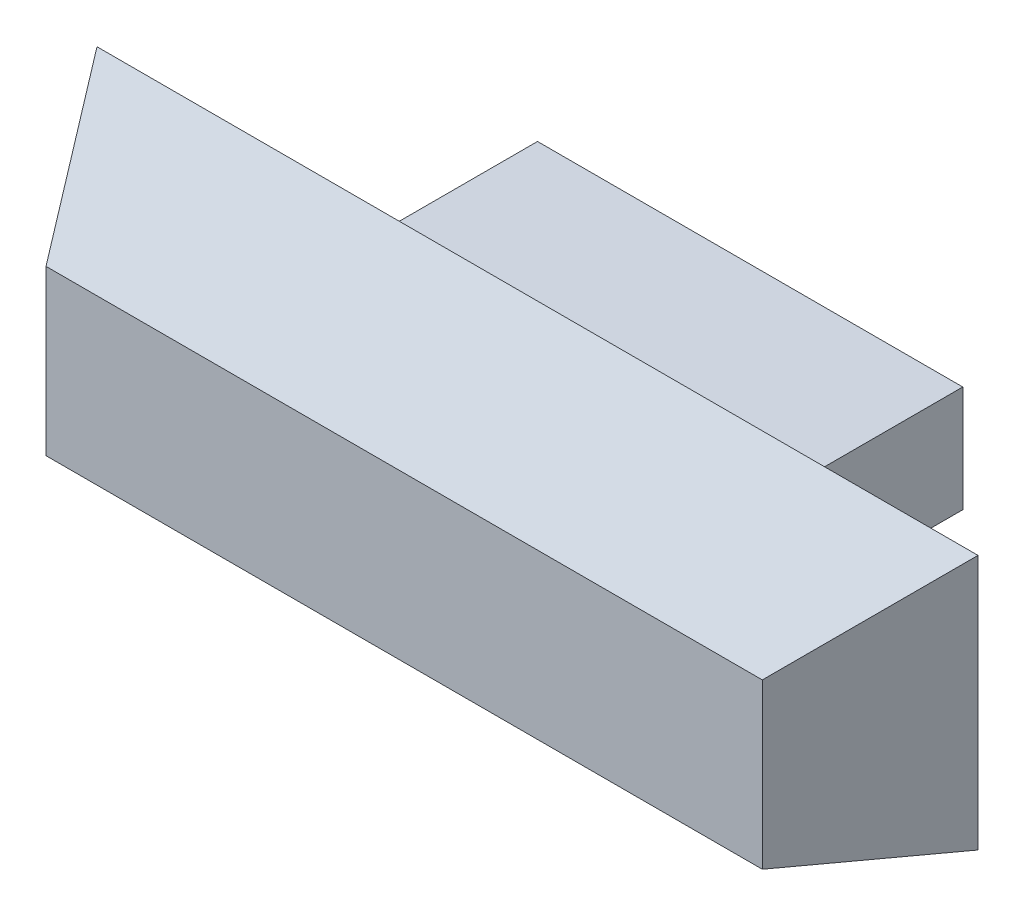
ISO-10303-21;
HEADER;
FILE_DESCRIPTION(('STEP AP214'),'2;1');
FILE_NAME('part.step','',(''),(''),'','','');
FILE_SCHEMA(('AUTOMOTIVE_DESIGN { 1 0 10303 214 1 1 1 1 }'));
ENDSEC;
DATA;
#1=APPLICATION_CONTEXT('core data for automotive mechanical design processes');
#2=APPLICATION_PROTOCOL_DEFINITION('international standard','automotive_design',2000,#1);
#3=PRODUCT_CONTEXT('',#1,'mechanical');
#4=PRODUCT('Part','Part','',(#3));
#5=PRODUCT_RELATED_PRODUCT_CATEGORY('part','',(#4));
#6=PRODUCT_DEFINITION_FORMATION('','',#4);
#7=PRODUCT_DEFINITION_CONTEXT('part definition',#1,'design');
#8=PRODUCT_DEFINITION('design','',#6,#7);
#9=PRODUCT_DEFINITION_SHAPE('','',#8);
#10=(LENGTH_UNIT() NAMED_UNIT(*) SI_UNIT(.MILLI.,.METRE.));
#11=(NAMED_UNIT(*) PLANE_ANGLE_UNIT() SI_UNIT($,.RADIAN.));
#12=(NAMED_UNIT(*) SI_UNIT($,.STERADIAN.) SOLID_ANGLE_UNIT());
#13=UNCERTAINTY_MEASURE_WITH_UNIT(LENGTH_MEASURE(1.E-05),#10,'distance_accuracy_value','');
#14=(GEOMETRIC_REPRESENTATION_CONTEXT(3) GLOBAL_UNCERTAINTY_ASSIGNED_CONTEXT((#13)) GLOBAL_UNIT_ASSIGNED_CONTEXT((#10,
#11,#12)) REPRESENTATION_CONTEXT('',''));
#15=CARTESIAN_POINT('',(0.,0.,0.));
#16=DIRECTION('',(0.,0.,1.));
#17=DIRECTION('',(1.,0.,0.));
#18=AXIS2_PLACEMENT_3D('',#15,#16,#17);
#19=CARTESIAN_POINT('',(0.,0.,2.54));
#20=DIRECTION('',(0.,0.,-1.));
#21=DIRECTION('',(-1.,0.,0.));
#22=AXIS2_PLACEMENT_3D('',#19,#20,#21);
#23=PLANE('',#22);
#24=DIRECTION('',(0.,-1.,0.));
#25=VECTOR('',#24,1.);
#26=CARTESIAN_POINT('',(72.1258566632054,0.,2.54));
#27=LINE('',#26,#25);
#28=CARTESIAN_POINT('',(72.1258566632054,66.7564090512267,2.54));
#29=VERTEX_POINT('',#28);
#30=CARTESIAN_POINT('',(72.1258566632054,64.3075909487768,2.54));
#31=VERTEX_POINT('',#30);
#32=EDGE_CURVE('E140',#29,#31,#27,.T.);
#33=ORIENTED_EDGE('',*,*,#32,.T.);
#34=DIRECTION('',(1.,0.,0.));
#35=VECTOR('',#34,1.);
#36=CARTESIAN_POINT('',(0.,64.3075909487768,2.54));
#37=LINE('',#36,#35);
#38=CARTESIAN_POINT('',(82.8219090512249,64.3075909487768,2.54));
#39=VERTEX_POINT('',#38);
#40=EDGE_CURVE('E147',#31,#39,#37,.T.);
#41=ORIENTED_EDGE('',*,*,#40,.T.);
#42=DIRECTION('',(0.,1.,0.));
#43=VECTOR('',#42,1.);
#44=CARTESIAN_POINT('',(82.8219090512249,0.,2.54));
#45=LINE('',#44,#43);
#46=CARTESIAN_POINT('',(82.8219090512249,66.7564090512267,2.54));
#47=VERTEX_POINT('',#46);
#48=EDGE_CURVE('E145',#39,#47,#45,.T.);
#49=ORIENTED_EDGE('',*,*,#48,.T.);
#50=DIRECTION('',(-1.,0.,0.));
#51=VECTOR('',#50,1.);
#52=CARTESIAN_POINT('',(0.,66.7564090512267,2.54));
#53=LINE('',#52,#51);
#54=EDGE_CURVE('E143',#47,#29,#53,.T.);
#55=ORIENTED_EDGE('',*,*,#54,.T.);
#56=EDGE_LOOP('',(#33,#41,#49,#55));
#57=FACE_BOUND('',#56,.T.);
#58=ADVANCED_FACE('F35',(#57),#23,.F.);
#59=CARTESIAN_POINT('',(0.,0.,0.));
#60=DIRECTION('',(0.,0.,-1.));
#61=DIRECTION('',(-1.,0.,0.));
#62=AXIS2_PLACEMENT_3D('',#59,#60,#61);
#63=PLANE('',#62);
#64=DIRECTION('',(0.,1.,0.));
#65=VECTOR('',#64,1.);
#66=CARTESIAN_POINT('',(73.7499147580763,66.3257500000017,0.));
#67=LINE('',#66,#65);
#68=CARTESIAN_POINT('',(73.7499147580763,64.7382500000017,0.));
#69=VERTEX_POINT('',#68);
#70=CARTESIAN_POINT('',(73.7499147580763,66.3257500000017,0.));
#71=VERTEX_POINT('',#70);
#72=EDGE_CURVE('E53',#69,#71,#67,.T.);
#73=ORIENTED_EDGE('',*,*,#72,.F.);
#74=DIRECTION('',(-1.,0.,0.));
#75=VECTOR('',#74,1.);
#76=CARTESIAN_POINT('',(80.0999147580763,64.7382500000017,0.));
#77=LINE('',#76,#75);
#78=CARTESIAN_POINT('',(80.0999147580763,64.7382500000017,0.));
#79=VERTEX_POINT('',#78);
#80=EDGE_CURVE('E57',#79,#69,#77,.T.);
#81=ORIENTED_EDGE('',*,*,#80,.F.);
#82=DIRECTION('',(0.,-1.,0.));
#83=VECTOR('',#82,1.);
#84=CARTESIAN_POINT('',(80.0999147580763,66.3257500000017,0.));
#85=LINE('',#84,#83);
#86=CARTESIAN_POINT('',(80.0999147580763,66.3257500000017,0.));
#87=VERTEX_POINT('',#86);
#88=EDGE_CURVE('E258',#87,#79,#85,.T.);
#89=ORIENTED_EDGE('',*,*,#88,.F.);
#90=DIRECTION('',(1.,0.,0.));
#91=VECTOR('',#90,1.);
#92=CARTESIAN_POINT('',(80.0999147580763,66.3257500000017,0.));
#93=LINE('',#92,#91);
#94=EDGE_CURVE('E264',#71,#87,#93,.T.);
#95=ORIENTED_EDGE('',*,*,#94,.F.);
#96=EDGE_LOOP('',(#73,#81,#89,#95));
#97=FACE_BOUND('',#96,.T.);
#98=DIRECTION('',(0.,1.,0.));
#99=VECTOR('',#98,1.);
#100=CARTESIAN_POINT('',(83.5025,67.4370000000018,0.));
#101=LINE('',#100,#99);
#102=CARTESIAN_POINT('',(83.5025,63.6270000000018,0.));
#103=VERTEX_POINT('',#102);
#104=CARTESIAN_POINT('',(83.5025,67.4370000000018,0.));
#105=VERTEX_POINT('',#104);
#106=EDGE_CURVE('E128',#103,#105,#101,.T.);
#107=ORIENTED_EDGE('',*,*,#106,.F.);
#108=DIRECTION('',(1.,0.,0.));
#109=VECTOR('',#108,1.);
#110=CARTESIAN_POINT('',(83.5025,63.6270000000018,0.));
#111=LINE('',#110,#109);
#112=CARTESIAN_POINT('',(70.3473295161528,63.6270000000018,0.));
#113=VERTEX_POINT('',#112);
#114=EDGE_CURVE('E137',#113,#103,#111,.T.);
#115=ORIENTED_EDGE('',*,*,#114,.F.);
#116=DIRECTION('',(0.,-1.,0.));
#117=VECTOR('',#116,1.);
#118=CARTESIAN_POINT('',(70.3473295161528,67.4370000000018,0.));
#119=LINE('',#118,#117);
#120=CARTESIAN_POINT('',(70.3473295161528,67.4370000000018,0.));
#121=VERTEX_POINT('',#120);
#122=EDGE_CURVE('E134',#121,#113,#119,.T.);
#123=ORIENTED_EDGE('',*,*,#122,.F.);
#124=DIRECTION('',(-1.,0.,0.));
#125=VECTOR('',#124,1.);
#126=CARTESIAN_POINT('',(83.5025,67.4370000000018,0.));
#127=LINE('',#126,#125);
#128=EDGE_CURVE('E131',#105,#121,#127,.T.);
#129=ORIENTED_EDGE('',*,*,#128,.F.);
#130=EDGE_LOOP('',(#107,#115,#123,#129));
#131=FACE_BOUND('',#130,.T.);
#132=ADVANCED_FACE('F159',(#97,#131),#63,.T.);
#133=CARTESIAN_POINT('',(72.1258566632054,0.,2.54));
#134=DIRECTION('',(0.819152044288994,0.,-0.573576436351043));
#135=DIRECTION('',(0.,-1.,0.));
#136=AXIS2_PLACEMENT_3D('',#133,#134,#135);
#137=PLANE('',#136);
#138=ORIENTED_EDGE('',*,*,#122,.T.);
#139=DIRECTION('',(0.560240011104919,0.214387664158802,0.800105655156676));
#140=VECTOR('',#139,1.);
#141=CARTESIAN_POINT('',(64.4019653308287,61.3518809171087,-8.4908600106266));
#142=LINE('',#141,#140);
#143=EDGE_CURVE('E11',#113,#31,#142,.T.);
#144=ORIENTED_EDGE('',*,*,#143,.T.);
#145=ORIENTED_EDGE('',*,*,#32,.F.);
#146=DIRECTION('',(-0.560240011104919,0.214387664158802,-0.800105655156676));
#147=VECTOR('',#146,1.);
#148=CARTESIAN_POINT('',(80.1438719805896,63.6881462691857,13.99091259355));
#149=LINE('',#148,#147);
#150=EDGE_CURVE('E45',#29,#121,#149,.T.);
#151=ORIENTED_EDGE('',*,*,#150,.T.);
#152=EDGE_LOOP('',(#138,#144,#145,#151));
#153=FACE_BOUND('',#152,.T.);
#154=ADVANCED_FACE('F154',(#153),#137,.F.);
#155=CARTESIAN_POINT('',(0.,66.7564090512267,2.54));
#156=DIRECTION('',(0.,-0.96592582628907,-0.258819045102516));
#157=DIRECTION('',(-1.,0.,0.));
#158=AXIS2_PLACEMENT_3D('',#155,#156,#157);
#159=PLANE('',#158);
#160=ORIENTED_EDGE('',*,*,#150,.F.);
#161=ORIENTED_EDGE('',*,*,#54,.F.);
#162=DIRECTION('',(0.250562807085728,0.250562807085728,-0.935113126531032));
#163=VECTOR('',#162,1.);
#164=CARTESIAN_POINT('',(77.6222071228995,61.5567071229013,21.9455517807246));
#165=LINE('',#164,#163);
#166=EDGE_CURVE('E40',#105,#47,#165,.F.);
#167=ORIENTED_EDGE('',*,*,#166,.F.);
#168=ORIENTED_EDGE('',*,*,#128,.T.);
#169=EDGE_LOOP('',(#160,#161,#167,#168));
#170=FACE_BOUND('',#169,.T.);
#171=ADVANCED_FACE('F38',(#170),#159,.F.);
#172=CARTESIAN_POINT('',(82.8219090512249,0.,2.54));
#173=DIRECTION('',(-0.96592582628907,0.,-0.258819045102516));
#174=DIRECTION('',(0.,1.,0.));
#175=AXIS2_PLACEMENT_3D('',#172,#173,#174);
#176=PLANE('',#175);
#177=ORIENTED_EDGE('',*,*,#166,.T.);
#178=ORIENTED_EDGE('',*,*,#48,.F.);
#179=DIRECTION('',(0.250562807085728,-0.250562807085728,-0.935113126531032));
#180=VECTOR('',#179,1.);
#181=CARTESIAN_POINT('',(86.8592502389957,60.270249761006,-12.5275624402513));
#182=LINE('',#181,#180);
#183=EDGE_CURVE('E122',#103,#39,#182,.F.);
#184=ORIENTED_EDGE('',*,*,#183,.F.);
#185=ORIENTED_EDGE('',*,*,#106,.T.);
#186=EDGE_LOOP('',(#177,#178,#184,#185));
#187=FACE_BOUND('',#186,.T.);
#188=ADVANCED_FACE('F165',(#187),#176,.F.);
#189=CARTESIAN_POINT('',(0.,64.3075909487768,2.54));
#190=DIRECTION('',(0.,0.96592582628907,-0.258819045102516));
#191=DIRECTION('',(1.,0.,0.));
#192=AXIS2_PLACEMENT_3D('',#189,#190,#191);
#193=PLANE('',#192);
#194=ORIENTED_EDGE('',*,*,#143,.F.);
#195=ORIENTED_EDGE('',*,*,#114,.T.);
#196=ORIENTED_EDGE('',*,*,#183,.T.);
#197=ORIENTED_EDGE('',*,*,#40,.F.);
#198=EDGE_LOOP('',(#194,#195,#196,#197));
#199=FACE_BOUND('',#198,.T.);
#200=ADVANCED_FACE('F167',(#199),#193,.F.);
#201=CARTESIAN_POINT('',(73.7499147580763,66.3257500000017,-3.175));
#202=DIRECTION('',(1.,0.,0.));
#203=DIRECTION('',(0.,0.,-1.));
#204=AXIS2_PLACEMENT_3D('',#201,#202,#203);
#205=PLANE('',#204);
#206=ORIENTED_EDGE('',*,*,#72,.T.);
#207=DIRECTION('',(0.,0.,1.));
#208=VECTOR('',#207,1.);
#209=CARTESIAN_POINT('',(73.7499147580763,66.3257500000017,-3.175));
#210=LINE('',#209,#208);
#211=CARTESIAN_POINT('',(73.7499147580763,66.3257500000017,-3.175));
#212=VERTEX_POINT('',#211);
#213=EDGE_CURVE('E105',#212,#71,#210,.T.);
#214=ORIENTED_EDGE('',*,*,#213,.F.);
#215=DIRECTION('',(0.,1.,0.));
#216=VECTOR('',#215,1.);
#217=CARTESIAN_POINT('',(73.7499147580763,66.3257500000017,-3.175));
#218=LINE('',#217,#216);
#219=CARTESIAN_POINT('',(73.7499147580763,64.7382500000017,-3.175));
#220=VERTEX_POINT('',#219);
#221=EDGE_CURVE('E111',#220,#212,#218,.T.);
#222=ORIENTED_EDGE('',*,*,#221,.F.);
#223=DIRECTION('',(0.,0.,1.));
#224=VECTOR('',#223,1.);
#225=CARTESIAN_POINT('',(73.7499147580763,64.7382500000017,-3.175));
#226=LINE('',#225,#224);
#227=EDGE_CURVE('E256',#220,#69,#226,.T.);
#228=ORIENTED_EDGE('',*,*,#227,.T.);
#229=EDGE_LOOP('',(#206,#214,#222,#228));
#230=FACE_BOUND('',#229,.T.);
#231=ADVANCED_FACE('F121',(#230),#205,.F.);
#232=CARTESIAN_POINT('',(80.0999147580763,66.3257500000017,-3.175));
#233=DIRECTION('',(0.,-1.,0.));
#234=DIRECTION('',(0.,0.,-1.));
#235=AXIS2_PLACEMENT_3D('',#232,#233,#234);
#236=PLANE('',#235);
#237=ORIENTED_EDGE('',*,*,#94,.T.);
#238=DIRECTION('',(0.,0.,1.));
#239=VECTOR('',#238,1.);
#240=CARTESIAN_POINT('',(80.0999147580763,66.3257500000017,-3.175));
#241=LINE('',#240,#239);
#242=CARTESIAN_POINT('',(80.0999147580763,66.3257500000017,-3.175));
#243=VERTEX_POINT('',#242);
#244=EDGE_CURVE('E107',#243,#87,#241,.T.);
#245=ORIENTED_EDGE('',*,*,#244,.F.);
#246=DIRECTION('',(1.,0.,0.));
#247=VECTOR('',#246,1.);
#248=CARTESIAN_POINT('',(80.0999147580763,66.3257500000017,-3.175));
#249=LINE('',#248,#247);
#250=EDGE_CURVE('E100',#212,#243,#249,.T.);
#251=ORIENTED_EDGE('',*,*,#250,.F.);
#252=ORIENTED_EDGE('',*,*,#213,.T.);
#253=EDGE_LOOP('',(#237,#245,#251,#252));
#254=FACE_BOUND('',#253,.T.);
#255=ADVANCED_FACE('F103',(#254),#236,.F.);
#256=CARTESIAN_POINT('',(80.0999147580763,66.3257500000017,-3.175));
#257=DIRECTION('',(-1.,0.,0.));
#258=DIRECTION('',(0.,0.,1.));
#259=AXIS2_PLACEMENT_3D('',#256,#257,#258);
#260=PLANE('',#259);
#261=ORIENTED_EDGE('',*,*,#88,.T.);
#262=DIRECTION('',(0.,0.,1.));
#263=VECTOR('',#262,1.);
#264=CARTESIAN_POINT('',(80.0999147580763,64.7382500000017,-3.175));
#265=LINE('',#264,#263);
#266=CARTESIAN_POINT('',(80.0999147580763,64.7382500000017,-3.175));
#267=VERTEX_POINT('',#266);
#268=EDGE_CURVE('E124',#267,#79,#265,.T.);
#269=ORIENTED_EDGE('',*,*,#268,.F.);
#270=DIRECTION('',(0.,-1.,0.));
#271=VECTOR('',#270,1.);
#272=CARTESIAN_POINT('',(80.0999147580763,66.3257500000017,-3.175));
#273=LINE('',#272,#271);
#274=EDGE_CURVE('E110',#243,#267,#273,.T.);
#275=ORIENTED_EDGE('',*,*,#274,.F.);
#276=ORIENTED_EDGE('',*,*,#244,.T.);
#277=EDGE_LOOP('',(#261,#269,#275,#276));
#278=FACE_BOUND('',#277,.T.);
#279=ADVANCED_FACE('F225',(#278),#260,.F.);
#280=CARTESIAN_POINT('',(80.0999147580763,64.7382500000017,-3.175));
#281=DIRECTION('',(0.,1.,0.));
#282=DIRECTION('',(0.,0.,1.));
#283=AXIS2_PLACEMENT_3D('',#280,#281,#282);
#284=PLANE('',#283);
#285=ORIENTED_EDGE('',*,*,#80,.T.);
#286=ORIENTED_EDGE('',*,*,#227,.F.);
#287=DIRECTION('',(-1.,0.,0.));
#288=VECTOR('',#287,1.);
#289=CARTESIAN_POINT('',(80.0999147580763,64.7382500000017,-3.175));
#290=LINE('',#289,#288);
#291=EDGE_CURVE('E116',#267,#220,#290,.T.);
#292=ORIENTED_EDGE('',*,*,#291,.F.);
#293=ORIENTED_EDGE('',*,*,#268,.T.);
#294=EDGE_LOOP('',(#285,#286,#292,#293));
#295=FACE_BOUND('',#294,.T.);
#296=ADVANCED_FACE('F233',(#295),#284,.F.);
#297=CARTESIAN_POINT('',(0.,0.,-3.175));
#298=DIRECTION('',(0.,0.,-1.));
#299=DIRECTION('',(-1.,0.,0.));
#300=AXIS2_PLACEMENT_3D('',#297,#298,#299);
#301=PLANE('',#300);
#302=ORIENTED_EDGE('',*,*,#221,.T.);
#303=ORIENTED_EDGE('',*,*,#250,.T.);
#304=ORIENTED_EDGE('',*,*,#274,.T.);
#305=ORIENTED_EDGE('',*,*,#291,.T.);
#306=EDGE_LOOP('',(#302,#303,#304,#305));
#307=FACE_BOUND('',#306,.T.);
#308=ADVANCED_FACE('F114',(#307),#301,.T.);
#309=CLOSED_SHELL('',(#58,#132,#154,#171,#188,#200,#231,#255,#279,#296,#308));
#310=MANIFOLD_SOLID_BREP('B2',#309);
#311=ADVANCED_BREP_SHAPE_REPRESENTATION('',(#18,#310),#14);
#312=SHAPE_DEFINITION_REPRESENTATION(#9,#311);
ENDSEC;
END-ISO-10303-21;
